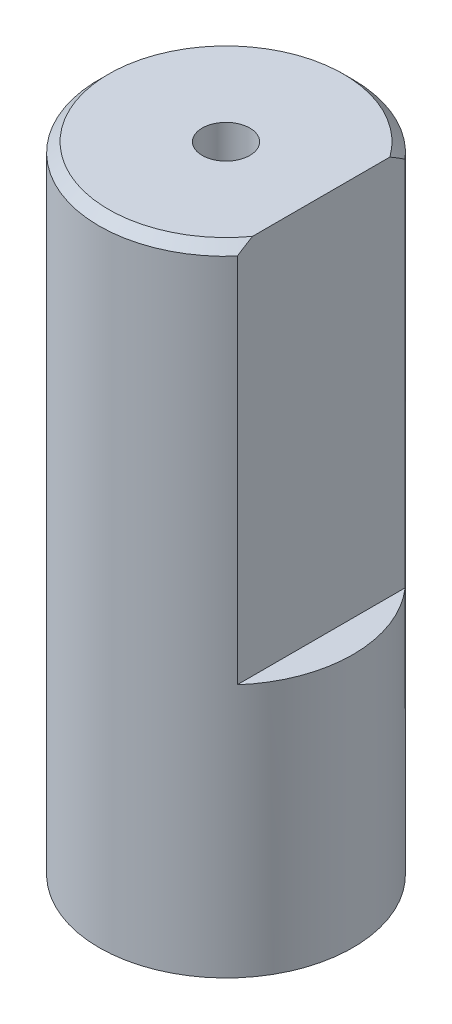
ISO-10303-21;
HEADER;
FILE_DESCRIPTION(('STEP AP214'),'2;1');
FILE_NAME('part.step','',(''),(''),'','','');
FILE_SCHEMA(('AUTOMOTIVE_DESIGN { 1 0 10303 214 1 1 1 1 }'));
ENDSEC;
DATA;
#1=APPLICATION_CONTEXT('core data for automotive mechanical design processes');
#2=APPLICATION_PROTOCOL_DEFINITION('international standard','automotive_design',2000,#1);
#3=PRODUCT_CONTEXT('',#1,'mechanical');
#4=PRODUCT('Part','Part','',(#3));
#5=PRODUCT_RELATED_PRODUCT_CATEGORY('part','',(#4));
#6=PRODUCT_DEFINITION_FORMATION('','',#4);
#7=PRODUCT_DEFINITION_CONTEXT('part definition',#1,'design');
#8=PRODUCT_DEFINITION('design','',#6,#7);
#9=PRODUCT_DEFINITION_SHAPE('','',#8);
#10=(LENGTH_UNIT() NAMED_UNIT(*) SI_UNIT(.MILLI.,.METRE.));
#11=(NAMED_UNIT(*) PLANE_ANGLE_UNIT() SI_UNIT($,.RADIAN.));
#12=(NAMED_UNIT(*) SI_UNIT($,.STERADIAN.) SOLID_ANGLE_UNIT());
#13=UNCERTAINTY_MEASURE_WITH_UNIT(LENGTH_MEASURE(1.E-05),#10,'distance_accuracy_value','');
#14=(GEOMETRIC_REPRESENTATION_CONTEXT(3) GLOBAL_UNCERTAINTY_ASSIGNED_CONTEXT((#13)) GLOBAL_UNIT_ASSIGNED_CONTEXT((#10,
#11,#12)) REPRESENTATION_CONTEXT('',''));
#15=CARTESIAN_POINT('',(0.,0.,0.));
#16=DIRECTION('',(0.,0.,1.));
#17=DIRECTION('',(1.,0.,0.));
#18=AXIS2_PLACEMENT_3D('',#15,#16,#17);
#19=CARTESIAN_POINT('',(0.,20.,0.));
#20=DIRECTION('',(0.,-1.,0.));
#21=DIRECTION('',(0.,0.,-1.));
#22=AXIS2_PLACEMENT_3D('',#19,#20,#21);
#23=CYLINDRICAL_SURFACE('',#22,4.);
#24=DIRECTION('',(0.,-1.,0.));
#25=VECTOR('',#24,1.);
#26=CARTESIAN_POINT('',(3.,20.,2.64575131106459));
#27=LINE('',#26,#25);
#28=CARTESIAN_POINT('',(3.,8.,2.64575131106459));
#29=VERTEX_POINT('',#28);
#30=CARTESIAN_POINT('',(3.,19.7,2.64575131106459));
#31=VERTEX_POINT('',#30);
#32=EDGE_CURVE('E80',#29,#31,#27,.F.);
#33=ORIENTED_EDGE('',*,*,#32,.T.);
#34=CARTESIAN_POINT('',(0.,19.7,0.));
#35=DIRECTION('',(0.,1.,0.));
#36=DIRECTION('',(0.,0.,1.));
#37=AXIS2_PLACEMENT_3D('',#34,#35,#36);
#38=CIRCLE('',#37,4.);
#39=CARTESIAN_POINT('',(3.,19.7,-2.64575131106459));
#40=VERTEX_POINT('',#39);
#41=EDGE_CURVE('E11',#31,#40,#38,.F.);
#42=ORIENTED_EDGE('',*,*,#41,.T.);
#43=DIRECTION('',(0.,-1.,0.));
#44=VECTOR('',#43,1.);
#45=CARTESIAN_POINT('',(3.,20.,-2.64575131106459));
#46=LINE('',#45,#44);
#47=CARTESIAN_POINT('',(3.,8.,-2.64575131106459));
#48=VERTEX_POINT('',#47);
#49=EDGE_CURVE('E72',#40,#48,#46,.T.);
#50=ORIENTED_EDGE('',*,*,#49,.T.);
#51=CARTESIAN_POINT('',(0.,8.,0.));
#52=DIRECTION('',(0.,-1.,0.));
#53=DIRECTION('',(0.,0.,-1.));
#54=AXIS2_PLACEMENT_3D('',#51,#52,#53);
#55=CIRCLE('',#54,4.);
#56=EDGE_CURVE('E75',#48,#29,#55,.T.);
#57=ORIENTED_EDGE('',*,*,#56,.T.);
#58=EDGE_LOOP('',(#33,#42,#50,#57));
#59=FACE_BOUND('',#58,.T.);
#60=CARTESIAN_POINT('',(0.,0.,0.));
#61=DIRECTION('',(0.,1.,0.));
#62=DIRECTION('',(0.,0.,1.));
#63=AXIS2_PLACEMENT_3D('',#60,#61,#62);
#64=CIRCLE('',#63,4.);
#65=CARTESIAN_POINT('',(0.,0.,4.));
#66=VERTEX_POINT('',#65);
#67=EDGE_CURVE('E79',#66,#66,#64,.T.);
#68=ORIENTED_EDGE('',*,*,#67,.T.);
#69=EDGE_LOOP('',(#68));
#70=FACE_BOUND('',#69,.T.);
#71=ADVANCED_FACE('F38',(#59,#70),#23,.T.);
#72=CARTESIAN_POINT('',(0.,20.,0.));
#73=DIRECTION('',(0.,1.,0.));
#74=DIRECTION('',(0.,0.,1.));
#75=AXIS2_PLACEMENT_3D('',#72,#73,#74);
#76=PLANE('',#75);
#77=CARTESIAN_POINT('',(0.,20.,0.));
#78=DIRECTION('',(0.,1.,0.));
#79=DIRECTION('',(0.,0.,1.));
#80=AXIS2_PLACEMENT_3D('',#77,#78,#79);
#81=CIRCLE('',#80,0.75);
#82=CARTESIAN_POINT('',(0.,20.,0.75));
#83=VERTEX_POINT('',#82);
#84=EDGE_CURVE('E94',#83,#83,#81,.T.);
#85=ORIENTED_EDGE('',*,*,#84,.F.);
#86=EDGE_LOOP('',(#85));
#87=FACE_BOUND('',#86,.T.);
#88=DIRECTION('',(0.,0.,1.));
#89=VECTOR('',#88,1.);
#90=CARTESIAN_POINT('',(3.,20.,0.));
#91=LINE('',#90,#89);
#92=CARTESIAN_POINT('',(3.,20.,-2.16564078277076));
#93=VERTEX_POINT('',#92);
#94=CARTESIAN_POINT('',(3.,20.,2.16564078277076));
#95=VERTEX_POINT('',#94);
#96=EDGE_CURVE('E87',#93,#95,#91,.T.);
#97=ORIENTED_EDGE('',*,*,#96,.F.);
#98=CARTESIAN_POINT('',(0.,20.,0.));
#99=DIRECTION('',(0.,1.,0.));
#100=DIRECTION('',(0.,0.,1.));
#101=AXIS2_PLACEMENT_3D('',#98,#99,#100);
#102=CIRCLE('',#101,3.69999999999999);
#103=EDGE_CURVE('E86',#93,#95,#102,.T.);
#104=ORIENTED_EDGE('',*,*,#103,.T.);
#105=EDGE_LOOP('',(#97,#104));
#106=FACE_BOUND('',#105,.T.);
#107=ADVANCED_FACE('F119',(#87,#106),#76,.T.);
#108=CARTESIAN_POINT('',(0.,0.,0.));
#109=DIRECTION('',(0.,1.,0.));
#110=DIRECTION('',(0.,0.,1.));
#111=AXIS2_PLACEMENT_3D('',#108,#109,#110);
#112=PLANE('',#111);
#113=CARTESIAN_POINT('',(0.,0.,0.));
#114=DIRECTION('',(0.,1.,0.));
#115=DIRECTION('',(0.,0.,1.));
#116=AXIS2_PLACEMENT_3D('',#113,#114,#115);
#117=CIRCLE('',#116,0.75);
#118=CARTESIAN_POINT('',(0.,0.,0.75));
#119=VERTEX_POINT('',#118);
#120=EDGE_CURVE('E90',#119,#119,#117,.T.);
#121=ORIENTED_EDGE('',*,*,#120,.T.);
#122=EDGE_LOOP('',(#121));
#123=FACE_BOUND('',#122,.T.);
#124=ORIENTED_EDGE('',*,*,#67,.F.);
#125=EDGE_LOOP('',(#124));
#126=FACE_BOUND('',#125,.T.);
#127=ADVANCED_FACE('F123',(#123,#126),#112,.F.);
#128=CARTESIAN_POINT('',(4.,8.,-10.));
#129=DIRECTION('',(0.,-1.,0.));
#130=DIRECTION('',(0.,0.,-1.));
#131=AXIS2_PLACEMENT_3D('',#128,#129,#130);
#132=PLANE('',#131);
#133=DIRECTION('',(0.,0.,1.));
#134=VECTOR('',#133,1.);
#135=CARTESIAN_POINT('',(3.,8.,-10.));
#136=LINE('',#135,#134);
#137=EDGE_CURVE('E85',#48,#29,#136,.T.);
#138=ORIENTED_EDGE('',*,*,#137,.T.);
#139=ORIENTED_EDGE('',*,*,#56,.F.);
#140=EDGE_LOOP('',(#138,#139));
#141=FACE_BOUND('',#140,.T.);
#142=ADVANCED_FACE('F84',(#141),#132,.F.);
#143=CARTESIAN_POINT('',(3.,8.,-10.));
#144=DIRECTION('',(-1.,0.,0.));
#145=DIRECTION('',(0.,0.,1.));
#146=AXIS2_PLACEMENT_3D('',#143,#144,#145);
#147=PLANE('',#146);
#148=ORIENTED_EDGE('',*,*,#96,.T.);
#149=CARTESIAN_POINT('',(3.,20.,2.16564078277076));
#150=CARTESIAN_POINT('',(3.,19.9761619312021,2.20636622215949));
#151=CARTESIAN_POINT('',(3.,19.95199678447,2.24689912393178));
#152=CARTESIAN_POINT('',(3.,19.9030718361086,2.32759423863401));
#153=CARTESIAN_POINT('',(3.,19.8783121465521,2.36775651948142));
#154=CARTESIAN_POINT('',(3.,19.8282492162508,2.44773910031968));
#155=CARTESIAN_POINT('',(3.,19.80294598771,2.48755940796063));
#156=CARTESIAN_POINT('',(3.,19.7518371229945,2.56688695576194));
#157=CARTESIAN_POINT('',(3.,19.7260313937379,2.60639413597521));
#158=CARTESIAN_POINT('',(3.,19.7000000000002,2.64575131106471));
#159=B_SPLINE_CURVE_WITH_KNOTS('',3,(#149,#150,#151,#152,#153,#154,#155,#156,#157,#158),
.UNSPECIFIED.,.F.,.F.,(4,2,2,2,4),(0.,0.141564544236564,0.28310260950946,0.424637500217344,
0.566198862693946),.UNSPECIFIED.);
#160=EDGE_CURVE('E48',#95,#31,#159,.T.);
#161=ORIENTED_EDGE('',*,*,#160,.T.);
#162=ORIENTED_EDGE('',*,*,#32,.F.);
#163=ORIENTED_EDGE('',*,*,#137,.F.);
#164=ORIENTED_EDGE('',*,*,#49,.F.);
#165=CARTESIAN_POINT('',(3.,19.7,-2.64575131106459));
#166=CARTESIAN_POINT('',(3.,19.7260313937378,-2.60639413597516));
#167=CARTESIAN_POINT('',(3.,19.7518371229945,-2.56688695576193));
#168=CARTESIAN_POINT('',(3.,19.80294598771,-2.48755940796066));
#169=CARTESIAN_POINT('',(3.,19.8282492162509,-2.4477391003197));
#170=CARTESIAN_POINT('',(3.,19.878312146552,-2.36775651948142));
#171=CARTESIAN_POINT('',(3.,19.9030718361086,-2.32759423863399));
#172=CARTESIAN_POINT('',(3.,19.9519967844701,-2.24689912393183));
#173=CARTESIAN_POINT('',(3.,19.9761619312022,-2.20636622215962));
#174=CARTESIAN_POINT('',(3.,20.0000000000005,-2.16564078277109));
#175=B_SPLINE_CURVE_WITH_KNOTS('',3,(#165,#166,#167,#168,#169,#170,#171,#172,#173,#174),
.UNSPECIFIED.,.F.,.F.,(4,2,2,2,4),(0.,0.141561362476602,0.283096253184488,0.424634318457375,
0.566198862693929),.UNSPECIFIED.);
#176=EDGE_CURVE('E105',#40,#93,#175,.T.);
#177=ORIENTED_EDGE('',*,*,#176,.T.);
#178=EDGE_LOOP('',(#148,#161,#162,#163,#164,#177));
#179=FACE_BOUND('',#178,.T.);
#180=ADVANCED_FACE('F89',(#179),#147,.F.);
#181=CARTESIAN_POINT('',(0.,20.,0.));
#182=DIRECTION('',(0.,-1.,0.));
#183=DIRECTION('',(0.,0.,-1.));
#184=AXIS2_PLACEMENT_3D('',#181,#182,#183);
#185=CONICAL_SURFACE('',#184,3.69999999999999,0.785398163397448);
#186=ORIENTED_EDGE('',*,*,#176,.F.);
#187=ORIENTED_EDGE('',*,*,#41,.F.);
#188=ORIENTED_EDGE('',*,*,#160,.F.);
#189=ORIENTED_EDGE('',*,*,#103,.F.);
#190=EDGE_LOOP('',(#186,#187,#188,#189));
#191=FACE_BOUND('',#190,.T.);
#192=ADVANCED_FACE('F40',(#191),#185,.T.);
#193=CARTESIAN_POINT('',(0.,0.,0.));
#194=DIRECTION('',(0.,1.,0.));
#195=DIRECTION('',(0.,0.,1.));
#196=AXIS2_PLACEMENT_3D('',#193,#194,#195);
#197=CYLINDRICAL_SURFACE('',#196,0.75);
#198=ORIENTED_EDGE('',*,*,#120,.F.);
#199=EDGE_LOOP('',(#198));
#200=FACE_BOUND('',#199,.T.);
#201=ORIENTED_EDGE('',*,*,#84,.T.);
#202=EDGE_LOOP('',(#201));
#203=FACE_BOUND('',#202,.T.);
#204=ADVANCED_FACE('F154',(#200,#203),#197,.F.);
#205=CLOSED_SHELL('',(#71,#107,#127,#142,#180,#192,#204));
#206=MANIFOLD_SOLID_BREP('B2',#205);
#207=ADVANCED_BREP_SHAPE_REPRESENTATION('',(#18,#206),#14);
#208=SHAPE_DEFINITION_REPRESENTATION(#9,#207);
ENDSEC;
END-ISO-10303-21;
